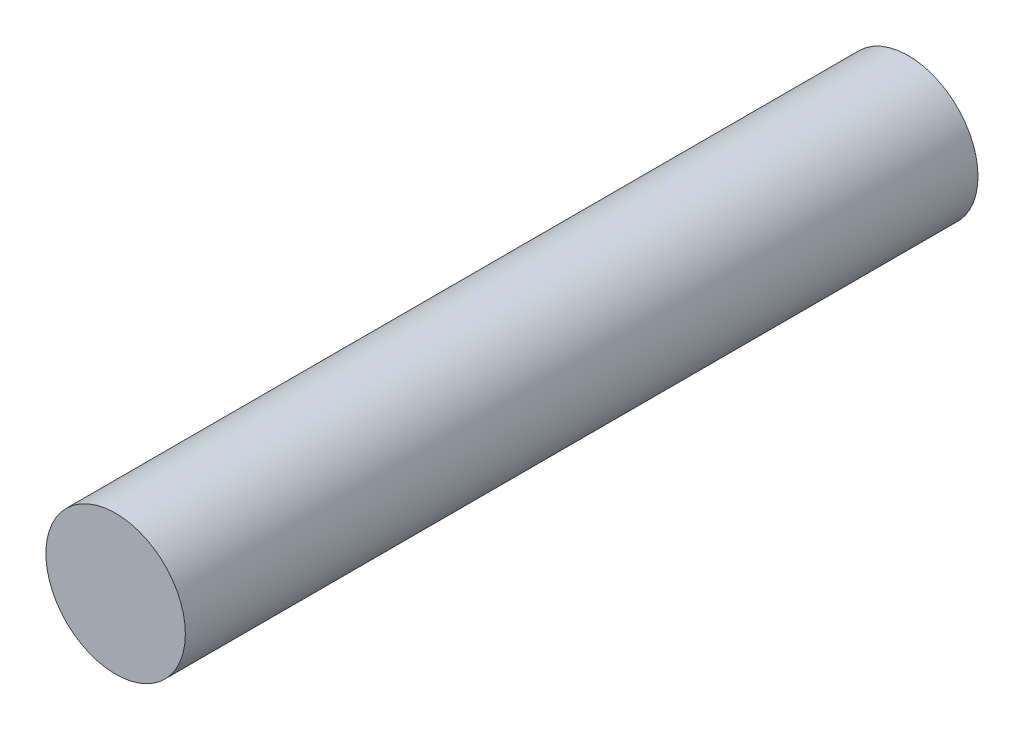
ISO-10303-21;
HEADER;
FILE_DESCRIPTION(('STEP AP214'),'2;1');
FILE_NAME('part.step','',(''),(''),'','','');
FILE_SCHEMA(('AUTOMOTIVE_DESIGN { 1 0 10303 214 1 1 1 1 }'));
ENDSEC;
DATA;
#1=APPLICATION_CONTEXT('core data for automotive mechanical design processes');
#2=APPLICATION_PROTOCOL_DEFINITION('international standard','automotive_design',2000,#1);
#3=PRODUCT_CONTEXT('',#1,'mechanical');
#4=PRODUCT('Part','Part','',(#3));
#5=PRODUCT_RELATED_PRODUCT_CATEGORY('part','',(#4));
#6=PRODUCT_DEFINITION_FORMATION('','',#4);
#7=PRODUCT_DEFINITION_CONTEXT('part definition',#1,'design');
#8=PRODUCT_DEFINITION('design','',#6,#7);
#9=PRODUCT_DEFINITION_SHAPE('','',#8);
#10=(LENGTH_UNIT() NAMED_UNIT(*) SI_UNIT(.MILLI.,.METRE.));
#11=(NAMED_UNIT(*) PLANE_ANGLE_UNIT() SI_UNIT($,.RADIAN.));
#12=(NAMED_UNIT(*) SI_UNIT($,.STERADIAN.) SOLID_ANGLE_UNIT());
#13=UNCERTAINTY_MEASURE_WITH_UNIT(LENGTH_MEASURE(1.E-05),#10,'distance_accuracy_value','');
#14=(GEOMETRIC_REPRESENTATION_CONTEXT(3) GLOBAL_UNCERTAINTY_ASSIGNED_CONTEXT((#13)) GLOBAL_UNIT_ASSIGNED_CONTEXT((#10,
#11,#12)) REPRESENTATION_CONTEXT('',''));
#15=CARTESIAN_POINT('',(0.,0.,0.));
#16=DIRECTION('',(0.,0.,1.));
#17=DIRECTION('',(1.,0.,0.));
#18=AXIS2_PLACEMENT_3D('',#15,#16,#17);
#19=CARTESIAN_POINT('',(0.,0.,250.));
#20=DIRECTION('',(0.,0.,-1.));
#21=DIRECTION('',(-1.,0.,0.));
#22=AXIS2_PLACEMENT_3D('',#19,#20,#21);
#23=CYLINDRICAL_SURFACE('',#22,22.);
#24=CARTESIAN_POINT('',(0.,0.,250.));
#25=DIRECTION('',(0.,0.,1.));
#26=DIRECTION('',(1.,0.,0.));
#27=AXIS2_PLACEMENT_3D('',#24,#25,#26);
#28=CIRCLE('',#27,22.);
#29=CARTESIAN_POINT('',(22.,0.,250.));
#30=VERTEX_POINT('',#29);
#31=EDGE_CURVE('E10',#30,#30,#28,.T.);
#32=ORIENTED_EDGE('',*,*,#31,.F.);
#33=EDGE_LOOP('',(#32));
#34=FACE_BOUND('',#33,.T.);
#35=CARTESIAN_POINT('',(0.,0.,0.));
#36=DIRECTION('',(0.,0.,1.));
#37=DIRECTION('',(1.,0.,0.));
#38=AXIS2_PLACEMENT_3D('',#35,#36,#37);
#39=CIRCLE('',#38,22.);
#40=CARTESIAN_POINT('',(22.,0.,0.));
#41=VERTEX_POINT('',#40);
#42=EDGE_CURVE('E34',#41,#41,#39,.T.);
#43=ORIENTED_EDGE('',*,*,#42,.T.);
#44=EDGE_LOOP('',(#43));
#45=FACE_BOUND('',#44,.T.);
#46=ADVANCED_FACE('F31',(#34,#45),#23,.T.);
#47=CARTESIAN_POINT('',(0.,0.,250.));
#48=DIRECTION('',(0.,0.,1.));
#49=DIRECTION('',(1.,0.,0.));
#50=AXIS2_PLACEMENT_3D('',#47,#48,#49);
#51=PLANE('',#50);
#52=ORIENTED_EDGE('',*,*,#31,.T.);
#53=EDGE_LOOP('',(#52));
#54=FACE_BOUND('',#53,.T.);
#55=ADVANCED_FACE('F46',(#54),#51,.T.);
#56=CARTESIAN_POINT('',(0.,0.,0.));
#57=DIRECTION('',(0.,0.,1.));
#58=DIRECTION('',(1.,0.,0.));
#59=AXIS2_PLACEMENT_3D('',#56,#57,#58);
#60=PLANE('',#59);
#61=ORIENTED_EDGE('',*,*,#42,.F.);
#62=EDGE_LOOP('',(#61));
#63=FACE_BOUND('',#62,.T.);
#64=ADVANCED_FACE('F44',(#63),#60,.F.);
#65=CLOSED_SHELL('',(#46,#55,#64));
#66=MANIFOLD_SOLID_BREP('B2',#65);
#67=ADVANCED_BREP_SHAPE_REPRESENTATION('',(#18,#66),#14);
#68=SHAPE_DEFINITION_REPRESENTATION(#9,#67);
ENDSEC;
END-ISO-10303-21;
